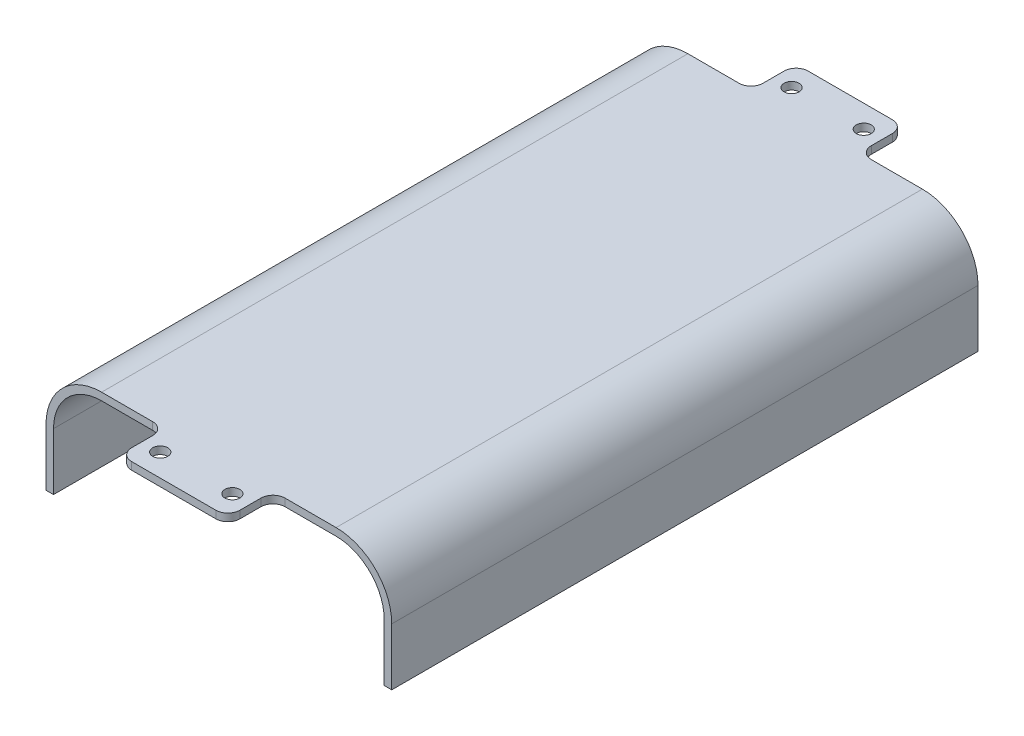
ISO-10303-21;
HEADER;
FILE_DESCRIPTION(('STEP AP214'),'2;1');
FILE_NAME('part.step','',(''),(''),'','','');
FILE_SCHEMA(('AUTOMOTIVE_DESIGN { 1 0 10303 214 1 1 1 1 }'));
ENDSEC;
DATA;
#1=APPLICATION_CONTEXT('core data for automotive mechanical design processes');
#2=APPLICATION_PROTOCOL_DEFINITION('international standard','automotive_design',2000,#1);
#3=PRODUCT_CONTEXT('',#1,'mechanical');
#4=PRODUCT('Part','Part','',(#3));
#5=PRODUCT_RELATED_PRODUCT_CATEGORY('part','',(#4));
#6=PRODUCT_DEFINITION_FORMATION('','',#4);
#7=PRODUCT_DEFINITION_CONTEXT('part definition',#1,'design');
#8=PRODUCT_DEFINITION('design','',#6,#7);
#9=PRODUCT_DEFINITION_SHAPE('','',#8);
#10=(LENGTH_UNIT() NAMED_UNIT(*) SI_UNIT(.MILLI.,.METRE.));
#11=(NAMED_UNIT(*) PLANE_ANGLE_UNIT() SI_UNIT($,.RADIAN.));
#12=(NAMED_UNIT(*) SI_UNIT($,.STERADIAN.) SOLID_ANGLE_UNIT());
#13=UNCERTAINTY_MEASURE_WITH_UNIT(LENGTH_MEASURE(1.E-05),#10,'distance_accuracy_value','');
#14=(GEOMETRIC_REPRESENTATION_CONTEXT(3) GLOBAL_UNCERTAINTY_ASSIGNED_CONTEXT((#13)) GLOBAL_UNIT_ASSIGNED_CONTEXT((#10,
#11,#12)) REPRESENTATION_CONTEXT('',''));
#15=CARTESIAN_POINT('',(0.,0.,0.));
#16=DIRECTION('',(0.,0.,1.));
#17=DIRECTION('',(1.,0.,0.));
#18=AXIS2_PLACEMENT_3D('',#15,#16,#17);
#19=CARTESIAN_POINT('',(-39.,1.50000000000002,225.));
#20=DIRECTION('',(0.,0.,1.));
#21=DIRECTION('',(1.,0.,0.));
#22=AXIS2_PLACEMENT_3D('',#19,#20,#21);
#23=PLANE('',#22);
#24=DIRECTION('',(0.,1.,0.));
#25=VECTOR('',#24,1.);
#26=CARTESIAN_POINT('',(14.,-17.5,225.));
#27=LINE('',#26,#25);
#28=CARTESIAN_POINT('',(14.,17.5,225.));
#29=VERTEX_POINT('',#28);
#30=CARTESIAN_POINT('',(14.,20.,225.));
#31=VERTEX_POINT('',#30);
#32=EDGE_CURVE('E495',#29,#31,#27,.T.);
#33=ORIENTED_EDGE('',*,*,#32,.T.);
#34=DIRECTION('',(-1.,0.,0.));
#35=VECTOR('',#34,1.);
#36=CARTESIAN_POINT('',(-39.,20.,225.));
#37=LINE('',#36,#35);
#38=CARTESIAN_POINT('',(-14.,20.,225.));
#39=VERTEX_POINT('',#38);
#40=EDGE_CURVE('E246',#31,#39,#37,.T.);
#41=ORIENTED_EDGE('',*,*,#40,.T.);
#42=DIRECTION('',(0.,1.,0.));
#43=VECTOR('',#42,1.);
#44=CARTESIAN_POINT('',(-14.,-17.5,225.));
#45=LINE('',#44,#43);
#46=CARTESIAN_POINT('',(-14.,17.5,225.));
#47=VERTEX_POINT('',#46);
#48=EDGE_CURVE('E434',#47,#39,#45,.T.);
#49=ORIENTED_EDGE('',*,*,#48,.F.);
#50=DIRECTION('',(-1.,0.,0.));
#51=VECTOR('',#50,1.);
#52=CARTESIAN_POINT('',(-39.,17.5,225.));
#53=LINE('',#52,#51);
#54=EDGE_CURVE('E354',#29,#47,#53,.T.);
#55=ORIENTED_EDGE('',*,*,#54,.F.);
#56=EDGE_LOOP('',(#33,#41,#49,#55));
#57=FACE_BOUND('',#56,.T.);
#58=ADVANCED_FACE('F34',(#57),#23,.T.);
#59=CARTESIAN_POINT('',(-39.,1.50000000000002,0.));
#60=DIRECTION('',(0.,0.,1.));
#61=DIRECTION('',(1.,0.,0.));
#62=AXIS2_PLACEMENT_3D('',#59,#60,#61);
#63=PLANE('',#62);
#64=DIRECTION('',(0.,1.,0.));
#65=VECTOR('',#64,1.);
#66=CARTESIAN_POINT('',(-14.,-17.5,0.));
#67=LINE('',#66,#65);
#68=CARTESIAN_POINT('',(-14.,17.5,0.));
#69=VERTEX_POINT('',#68);
#70=CARTESIAN_POINT('',(-14.,20.,0.));
#71=VERTEX_POINT('',#70);
#72=EDGE_CURVE('E403',#69,#71,#67,.T.);
#73=ORIENTED_EDGE('',*,*,#72,.T.);
#74=DIRECTION('',(-1.,0.,0.));
#75=VECTOR('',#74,1.);
#76=CARTESIAN_POINT('',(-39.,20.,0.));
#77=LINE('',#76,#75);
#78=CARTESIAN_POINT('',(14.,20.,0.));
#79=VERTEX_POINT('',#78);
#80=EDGE_CURVE('E252',#79,#71,#77,.T.);
#81=ORIENTED_EDGE('',*,*,#80,.F.);
#82=DIRECTION('',(0.,1.,0.));
#83=VECTOR('',#82,1.);
#84=CARTESIAN_POINT('',(14.,-17.5,0.));
#85=LINE('',#84,#83);
#86=CARTESIAN_POINT('',(14.,17.5,0.));
#87=VERTEX_POINT('',#86);
#88=EDGE_CURVE('E239',#87,#79,#85,.T.);
#89=ORIENTED_EDGE('',*,*,#88,.F.);
#90=DIRECTION('',(-1.,0.,0.));
#91=VECTOR('',#90,1.);
#92=CARTESIAN_POINT('',(-39.,17.5,0.));
#93=LINE('',#92,#91);
#94=EDGE_CURVE('E302',#87,#69,#93,.T.);
#95=ORIENTED_EDGE('',*,*,#94,.T.);
#96=EDGE_LOOP('',(#73,#81,#89,#95));
#97=FACE_BOUND('',#96,.T.);
#98=ADVANCED_FACE('F466',(#97),#63,.F.);
#99=CARTESIAN_POINT('',(-55.,-17.5,225.));
#100=DIRECTION('',(0.,1.,0.));
#101=DIRECTION('',(0.,0.,1.));
#102=AXIS2_PLACEMENT_3D('',#99,#100,#101);
#103=PLANE('',#102);
#104=DIRECTION('',(0.,0.,-1.));
#105=VECTOR('',#104,1.);
#106=CARTESIAN_POINT('',(-57.5,-17.5,225.));
#107=LINE('',#106,#105);
#108=CARTESIAN_POINT('',(-57.5,-17.5,210.));
#109=VERTEX_POINT('',#108);
#110=CARTESIAN_POINT('',(-57.5,-17.5,15.));
#111=VERTEX_POINT('',#110);
#112=EDGE_CURVE('E245',#109,#111,#107,.T.);
#113=ORIENTED_EDGE('',*,*,#112,.T.);
#114=DIRECTION('',(1.,0.,0.));
#115=VECTOR('',#114,1.);
#116=CARTESIAN_POINT('',(-22.,-17.5,15.));
#117=LINE('',#116,#115);
#118=CARTESIAN_POINT('',(-55.,-17.5,15.));
#119=VERTEX_POINT('',#118);
#120=EDGE_CURVE('E394',#111,#119,#117,.T.);
#121=ORIENTED_EDGE('',*,*,#120,.T.);
#122=DIRECTION('',(0.,0.,-1.));
#123=VECTOR('',#122,1.);
#124=CARTESIAN_POINT('',(-55.,-17.5,225.));
#125=LINE('',#124,#123);
#126=CARTESIAN_POINT('',(-55.,-17.5,210.));
#127=VERTEX_POINT('',#126);
#128=EDGE_CURVE('E360',#127,#119,#125,.T.);
#129=ORIENTED_EDGE('',*,*,#128,.F.);
#130=DIRECTION('',(-1.,0.,0.));
#131=VECTOR('',#130,1.);
#132=CARTESIAN_POINT('',(-22.,-17.5,210.));
#133=LINE('',#132,#131);
#134=EDGE_CURVE('E451',#127,#109,#133,.T.);
#135=ORIENTED_EDGE('',*,*,#134,.T.);
#136=EDGE_LOOP('',(#113,#121,#129,#135));
#137=FACE_BOUND('',#136,.T.);
#138=ADVANCED_FACE('F570',(#137),#103,.F.);
#139=CARTESIAN_POINT('',(57.5,1.50000000000002,225.));
#140=DIRECTION('',(-1.,0.,0.));
#141=DIRECTION('',(0.,0.,1.));
#142=AXIS2_PLACEMENT_3D('',#139,#140,#141);
#143=PLANE('',#142);
#144=DIRECTION('',(0.,0.,-1.));
#145=VECTOR('',#144,1.);
#146=CARTESIAN_POINT('',(57.5,-17.5,225.));
#147=LINE('',#146,#145);
#148=CARTESIAN_POINT('',(57.5,-17.5,210.));
#149=VERTEX_POINT('',#148);
#150=CARTESIAN_POINT('',(57.5,-17.5,15.));
#151=VERTEX_POINT('',#150);
#152=EDGE_CURVE('E236',#149,#151,#147,.T.);
#153=ORIENTED_EDGE('',*,*,#152,.T.);
#154=DIRECTION('',(0.,1.,0.));
#155=VECTOR('',#154,1.);
#156=CARTESIAN_POINT('',(57.5,-17.5,15.));
#157=LINE('',#156,#155);
#158=CARTESIAN_POINT('',(57.5,1.50000000000002,15.));
#159=VERTEX_POINT('',#158);
#160=EDGE_CURVE('E217',#151,#159,#157,.T.);
#161=ORIENTED_EDGE('',*,*,#160,.T.);
#162=DIRECTION('',(0.,0.,-1.));
#163=VECTOR('',#162,1.);
#164=CARTESIAN_POINT('',(57.5,1.50000000000002,225.));
#165=LINE('',#164,#163);
#166=CARTESIAN_POINT('',(57.5,1.50000000000002,210.));
#167=VERTEX_POINT('',#166);
#168=EDGE_CURVE('E263',#167,#159,#165,.T.);
#169=ORIENTED_EDGE('',*,*,#168,.F.);
#170=DIRECTION('',(0.,1.,0.));
#171=VECTOR('',#170,1.);
#172=CARTESIAN_POINT('',(57.5,-17.5,210.));
#173=LINE('',#172,#171);
#174=EDGE_CURVE('E244',#149,#167,#173,.T.);
#175=ORIENTED_EDGE('',*,*,#174,.F.);
#176=EDGE_LOOP('',(#153,#161,#169,#175));
#177=FACE_BOUND('',#176,.T.);
#178=ADVANCED_FACE('F243',(#177),#143,.F.);
#179=CARTESIAN_POINT('',(39.,1.50000000000002,225.));
#180=DIRECTION('',(0.,0.,-1.));
#181=DIRECTION('',(-1.,0.,0.));
#182=AXIS2_PLACEMENT_3D('',#179,#180,#181);
#183=CYLINDRICAL_SURFACE('',#182,18.5);
#184=ORIENTED_EDGE('',*,*,#168,.T.);
#185=CARTESIAN_POINT('',(39.,1.50000000000002,15.));
#186=DIRECTION('',(0.,0.,1.));
#187=DIRECTION('',(1.,0.,0.));
#188=AXIS2_PLACEMENT_3D('',#185,#186,#187);
#189=CIRCLE('',#188,18.5);
#190=CARTESIAN_POINT('',(39.,20.,15.));
#191=VERTEX_POINT('',#190);
#192=EDGE_CURVE('E223',#159,#191,#189,.T.);
#193=ORIENTED_EDGE('',*,*,#192,.T.);
#194=DIRECTION('',(0.,0.,-1.));
#195=VECTOR('',#194,1.);
#196=CARTESIAN_POINT('',(39.,20.,225.));
#197=LINE('',#196,#195);
#198=CARTESIAN_POINT('',(39.,20.,210.));
#199=VERTEX_POINT('',#198);
#200=EDGE_CURVE('E373',#199,#191,#197,.T.);
#201=ORIENTED_EDGE('',*,*,#200,.F.);
#202=CARTESIAN_POINT('',(39.,1.50000000000002,210.));
#203=DIRECTION('',(0.,0.,-1.));
#204=DIRECTION('',(-1.,0.,0.));
#205=AXIS2_PLACEMENT_3D('',#202,#203,#204);
#206=CIRCLE('',#205,18.5);
#207=EDGE_CURVE('E346',#199,#167,#206,.T.);
#208=ORIENTED_EDGE('',*,*,#207,.T.);
#209=EDGE_LOOP('',(#184,#193,#201,#208));
#210=FACE_BOUND('',#209,.T.);
#211=ADVANCED_FACE('F538',(#210),#183,.T.);
#212=CARTESIAN_POINT('',(-39.,20.,225.));
#213=DIRECTION('',(0.,-1.,0.));
#214=DIRECTION('',(0.,0.,-1.));
#215=AXIS2_PLACEMENT_3D('',#212,#213,#214);
#216=PLANE('',#215);
#217=CARTESIAN_POINT('',(12.,20.,7.5));
#218=DIRECTION('',(0.,1.,0.));
#219=DIRECTION('',(0.,0.,1.));
#220=AXIS2_PLACEMENT_3D('',#217,#218,#219);
#221=CIRCLE('',#220,2.5);
#222=CARTESIAN_POINT('',(12.,20.,10.));
#223=VERTEX_POINT('',#222);
#224=EDGE_CURVE('E406',#223,#223,#221,.T.);
#225=ORIENTED_EDGE('',*,*,#224,.F.);
#226=EDGE_LOOP('',(#225));
#227=FACE_BOUND('',#226,.T.);
#228=CARTESIAN_POINT('',(-12.,20.,7.5));
#229=DIRECTION('',(0.,1.,0.));
#230=DIRECTION('',(0.,0.,1.));
#231=AXIS2_PLACEMENT_3D('',#228,#229,#230);
#232=CIRCLE('',#231,2.5);
#233=CARTESIAN_POINT('',(-12.,20.,10.));
#234=VERTEX_POINT('',#233);
#235=EDGE_CURVE('E413',#234,#234,#232,.T.);
#236=ORIENTED_EDGE('',*,*,#235,.F.);
#237=EDGE_LOOP('',(#236));
#238=FACE_BOUND('',#237,.T.);
#239=CARTESIAN_POINT('',(12.,20.,217.5));
#240=DIRECTION('',(0.,1.,0.));
#241=DIRECTION('',(0.,0.,-1.));
#242=AXIS2_PLACEMENT_3D('',#239,#240,#241);
#243=CIRCLE('',#242,2.49999999999999);
#244=CARTESIAN_POINT('',(12.,20.,215.));
#245=VERTEX_POINT('',#244);
#246=EDGE_CURVE('E409',#245,#245,#243,.T.);
#247=ORIENTED_EDGE('',*,*,#246,.F.);
#248=EDGE_LOOP('',(#247));
#249=FACE_BOUND('',#248,.T.);
#250=CARTESIAN_POINT('',(-12.,20.,217.5));
#251=DIRECTION('',(0.,1.,0.));
#252=DIRECTION('',(0.,0.,-1.));
#253=AXIS2_PLACEMENT_3D('',#250,#251,#252);
#254=CIRCLE('',#253,2.5);
#255=CARTESIAN_POINT('',(-12.,20.,215.));
#256=VERTEX_POINT('',#255);
#257=EDGE_CURVE('E412',#256,#256,#254,.T.);
#258=ORIENTED_EDGE('',*,*,#257,.F.);
#259=EDGE_LOOP('',(#258));
#260=FACE_BOUND('',#259,.T.);
#261=CARTESIAN_POINT('',(-22.,20.,11.));
#262=DIRECTION('',(0.,1.,0.));
#263=DIRECTION('',(0.,0.,-1.));
#264=AXIS2_PLACEMENT_3D('',#261,#262,#263);
#265=CIRCLE('',#264,4.);
#266=CARTESIAN_POINT('',(-22.,20.,15.));
#267=VERTEX_POINT('',#266);
#268=CARTESIAN_POINT('',(-18.,20.,11.));
#269=VERTEX_POINT('',#268);
#270=EDGE_CURVE('E228',#267,#269,#265,.T.);
#271=ORIENTED_EDGE('',*,*,#270,.F.);
#272=DIRECTION('',(1.,0.,0.));
#273=VECTOR('',#272,1.);
#274=CARTESIAN_POINT('',(-74.033168474898,20.,15.));
#275=LINE('',#274,#273);
#276=CARTESIAN_POINT('',(-39.,20.,15.));
#277=VERTEX_POINT('',#276);
#278=EDGE_CURVE('E390',#277,#267,#275,.T.);
#279=ORIENTED_EDGE('',*,*,#278,.F.);
#280=DIRECTION('',(0.,0.,-1.));
#281=VECTOR('',#280,1.);
#282=CARTESIAN_POINT('',(-39.,20.,225.));
#283=LINE('',#282,#281);
#284=CARTESIAN_POINT('',(-39.,20.,210.));
#285=VERTEX_POINT('',#284);
#286=EDGE_CURVE('E375',#285,#277,#283,.T.);
#287=ORIENTED_EDGE('',*,*,#286,.F.);
#288=DIRECTION('',(-1.,0.,0.));
#289=VECTOR('',#288,1.);
#290=CARTESIAN_POINT('',(-74.033168474898,20.,210.));
#291=LINE('',#290,#289);
#292=CARTESIAN_POINT('',(-22.,20.,210.));
#293=VERTEX_POINT('',#292);
#294=EDGE_CURVE('E455',#293,#285,#291,.T.);
#295=ORIENTED_EDGE('',*,*,#294,.F.);
#296=CARTESIAN_POINT('',(-22.,20.,214.));
#297=DIRECTION('',(0.,1.,0.));
#298=DIRECTION('',(0.,0.,1.));
#299=AXIS2_PLACEMENT_3D('',#296,#297,#298);
#300=CIRCLE('',#299,4.);
#301=CARTESIAN_POINT('',(-18.,20.,214.));
#302=VERTEX_POINT('',#301);
#303=EDGE_CURVE('E433',#302,#293,#300,.T.);
#304=ORIENTED_EDGE('',*,*,#303,.F.);
#305=DIRECTION('',(0.,0.,-1.));
#306=VECTOR('',#305,1.);
#307=CARTESIAN_POINT('',(-18.,20.,221.));
#308=LINE('',#307,#306);
#309=CARTESIAN_POINT('',(-18.,20.,221.));
#310=VERTEX_POINT('',#309);
#311=EDGE_CURVE('E512',#310,#302,#308,.T.);
#312=ORIENTED_EDGE('',*,*,#311,.F.);
#313=CARTESIAN_POINT('',(-14.,20.,221.));
#314=DIRECTION('',(0.,-1.,0.));
#315=DIRECTION('',(0.,0.,1.));
#316=AXIS2_PLACEMENT_3D('',#313,#314,#315);
#317=CIRCLE('',#316,4.);
#318=EDGE_CURVE('E449',#39,#310,#317,.T.);
#319=ORIENTED_EDGE('',*,*,#318,.F.);
#320=ORIENTED_EDGE('',*,*,#40,.F.);
#321=CARTESIAN_POINT('',(14.,20.,221.));
#322=DIRECTION('',(0.,-1.,0.));
#323=DIRECTION('',(0.,0.,-1.));
#324=AXIS2_PLACEMENT_3D('',#321,#322,#323);
#325=CIRCLE('',#324,4.);
#326=CARTESIAN_POINT('',(18.,20.,221.));
#327=VERTEX_POINT('',#326);
#328=EDGE_CURVE('E497',#327,#31,#325,.T.);
#329=ORIENTED_EDGE('',*,*,#328,.F.);
#330=DIRECTION('',(0.,0.,1.));
#331=VECTOR('',#330,1.);
#332=CARTESIAN_POINT('',(18.,20.,221.));
#333=LINE('',#332,#331);
#334=CARTESIAN_POINT('',(18.,20.,214.));
#335=VERTEX_POINT('',#334);
#336=EDGE_CURVE('E496',#335,#327,#333,.T.);
#337=ORIENTED_EDGE('',*,*,#336,.F.);
#338=CARTESIAN_POINT('',(22.,20.,214.));
#339=DIRECTION('',(0.,1.,0.));
#340=DIRECTION('',(0.,0.,1.));
#341=AXIS2_PLACEMENT_3D('',#338,#339,#340);
#342=CIRCLE('',#341,4.00000000000002);
#343=CARTESIAN_POINT('',(22.,20.,210.));
#344=VERTEX_POINT('',#343);
#345=EDGE_CURVE('E501',#344,#335,#342,.T.);
#346=ORIENTED_EDGE('',*,*,#345,.F.);
#347=DIRECTION('',(-1.,0.,0.));
#348=VECTOR('',#347,1.);
#349=CARTESIAN_POINT('',(22.,20.,210.));
#350=LINE('',#349,#348);
#351=EDGE_CURVE('E499',#199,#344,#350,.T.);
#352=ORIENTED_EDGE('',*,*,#351,.F.);
#353=ORIENTED_EDGE('',*,*,#200,.T.);
#354=DIRECTION('',(1.,0.,0.));
#355=VECTOR('',#354,1.);
#356=CARTESIAN_POINT('',(22.,20.,15.));
#357=LINE('',#356,#355);
#358=CARTESIAN_POINT('',(22.,20.,15.));
#359=VERTEX_POINT('',#358);
#360=EDGE_CURVE('E240',#359,#191,#357,.T.);
#361=ORIENTED_EDGE('',*,*,#360,.F.);
#362=CARTESIAN_POINT('',(22.,20.,11.));
#363=DIRECTION('',(0.,1.,0.));
#364=DIRECTION('',(0.,0.,-1.));
#365=AXIS2_PLACEMENT_3D('',#362,#363,#364);
#366=CIRCLE('',#365,4.);
#367=CARTESIAN_POINT('',(18.,20.,11.));
#368=VERTEX_POINT('',#367);
#369=EDGE_CURVE('E481',#368,#359,#366,.T.);
#370=ORIENTED_EDGE('',*,*,#369,.F.);
#371=DIRECTION('',(0.,0.,1.));
#372=VECTOR('',#371,1.);
#373=CARTESIAN_POINT('',(18.,20.,4.00000000000003));
#374=LINE('',#373,#372);
#375=CARTESIAN_POINT('',(18.,20.,4.00000000000003));
#376=VERTEX_POINT('',#375);
#377=EDGE_CURVE('E478',#376,#368,#374,.T.);
#378=ORIENTED_EDGE('',*,*,#377,.F.);
#379=CARTESIAN_POINT('',(14.,20.,4.));
#380=DIRECTION('',(0.,-1.,0.));
#381=DIRECTION('',(0.,0.,1.));
#382=AXIS2_PLACEMENT_3D('',#379,#380,#381);
#383=CIRCLE('',#382,4.);
#384=EDGE_CURVE('E473',#79,#376,#383,.T.);
#385=ORIENTED_EDGE('',*,*,#384,.F.);
#386=ORIENTED_EDGE('',*,*,#80,.T.);
#387=CARTESIAN_POINT('',(-14.,20.,4.));
#388=DIRECTION('',(0.,-1.,0.));
#389=DIRECTION('',(0.,0.,-1.));
#390=AXIS2_PLACEMENT_3D('',#387,#388,#389);
#391=CIRCLE('',#390,4.);
#392=CARTESIAN_POINT('',(-18.,20.,4.00000000000003));
#393=VERTEX_POINT('',#392);
#394=EDGE_CURVE('E395',#393,#71,#391,.T.);
#395=ORIENTED_EDGE('',*,*,#394,.F.);
#396=DIRECTION('',(0.,0.,-1.));
#397=VECTOR('',#396,1.);
#398=CARTESIAN_POINT('',(-18.,20.,4.00000000000003));
#399=LINE('',#398,#397);
#400=EDGE_CURVE('E399',#269,#393,#399,.T.);
#401=ORIENTED_EDGE('',*,*,#400,.F.);
#402=EDGE_LOOP('',(#271,#279,#287,#295,#304,#312,#319,#320,#329,#337,#346,#352,#353,#361,#370,
#378,#385,#386,#395,#401));
#403=FACE_BOUND('',#402,.T.);
#404=ADVANCED_FACE('F392',(#227,#238,#249,#260,#403),#216,.F.);
#405=CARTESIAN_POINT('',(-39.,1.50000000000002,225.));
#406=DIRECTION('',(0.,0.,-1.));
#407=DIRECTION('',(-1.,0.,0.));
#408=AXIS2_PLACEMENT_3D('',#405,#406,#407);
#409=CYLINDRICAL_SURFACE('',#408,18.5);
#410=ORIENTED_EDGE('',*,*,#286,.T.);
#411=CARTESIAN_POINT('',(-39.,1.50000000000002,15.));
#412=DIRECTION('',(0.,0.,1.));
#413=DIRECTION('',(1.,0.,0.));
#414=AXIS2_PLACEMENT_3D('',#411,#412,#413);
#415=CIRCLE('',#414,18.5);
#416=CARTESIAN_POINT('',(-57.5,1.50000000000002,15.));
#417=VERTEX_POINT('',#416);
#418=EDGE_CURVE('E270',#277,#417,#415,.T.);
#419=ORIENTED_EDGE('',*,*,#418,.T.);
#420=DIRECTION('',(0.,0.,-1.));
#421=VECTOR('',#420,1.);
#422=CARTESIAN_POINT('',(-57.5,1.50000000000002,225.));
#423=LINE('',#422,#421);
#424=CARTESIAN_POINT('',(-57.5,1.50000000000002,210.));
#425=VERTEX_POINT('',#424);
#426=EDGE_CURVE('E249',#425,#417,#423,.T.);
#427=ORIENTED_EDGE('',*,*,#426,.F.);
#428=CARTESIAN_POINT('',(-39.,1.50000000000002,210.));
#429=DIRECTION('',(0.,0.,-1.));
#430=DIRECTION('',(-1.,0.,0.));
#431=AXIS2_PLACEMENT_3D('',#428,#429,#430);
#432=CIRCLE('',#431,18.5);
#433=EDGE_CURVE('E337',#425,#285,#432,.T.);
#434=ORIENTED_EDGE('',*,*,#433,.T.);
#435=EDGE_LOOP('',(#410,#419,#427,#434));
#436=FACE_BOUND('',#435,.T.);
#437=ADVANCED_FACE('F386',(#436),#409,.T.);
#438=CARTESIAN_POINT('',(-57.5,1.50000000000002,225.));
#439=DIRECTION('',(1.,0.,0.));
#440=DIRECTION('',(0.,0.,-1.));
#441=AXIS2_PLACEMENT_3D('',#438,#439,#440);
#442=PLANE('',#441);
#443=ORIENTED_EDGE('',*,*,#426,.T.);
#444=DIRECTION('',(0.,-1.,0.));
#445=VECTOR('',#444,1.);
#446=CARTESIAN_POINT('',(-57.5,1.50000000000002,15.));
#447=LINE('',#446,#445);
#448=EDGE_CURVE('E332',#417,#111,#447,.T.);
#449=ORIENTED_EDGE('',*,*,#448,.T.);
#450=ORIENTED_EDGE('',*,*,#112,.F.);
#451=DIRECTION('',(0.,1.,0.));
#452=VECTOR('',#451,1.);
#453=CARTESIAN_POINT('',(-57.5,1.50000000000002,210.));
#454=LINE('',#453,#452);
#455=EDGE_CURVE('E385',#109,#425,#454,.T.);
#456=ORIENTED_EDGE('',*,*,#455,.T.);
#457=EDGE_LOOP('',(#443,#449,#450,#456));
#458=FACE_BOUND('',#457,.T.);
#459=ADVANCED_FACE('F36',(#458),#442,.F.);
#460=DIRECTION('',(0.,0.,-1.));
#461=VECTOR('',#460,1.);
#462=CARTESIAN_POINT('',(55.,-17.5,225.));
#463=LINE('',#462,#461);
#464=CARTESIAN_POINT('',(55.,-17.5,210.));
#465=VERTEX_POINT('',#464);
#466=CARTESIAN_POINT('',(55.,-17.5,15.));
#467=VERTEX_POINT('',#466);
#468=EDGE_CURVE('E238',#465,#467,#463,.T.);
#469=ORIENTED_EDGE('',*,*,#468,.T.);
#470=DIRECTION('',(1.,0.,0.));
#471=VECTOR('',#470,1.);
#472=CARTESIAN_POINT('',(22.,-17.5,15.));
#473=LINE('',#472,#471);
#474=EDGE_CURVE('E220',#467,#151,#473,.T.);
#475=ORIENTED_EDGE('',*,*,#474,.T.);
#476=ORIENTED_EDGE('',*,*,#152,.F.);
#477=DIRECTION('',(-1.,0.,0.));
#478=VECTOR('',#477,1.);
#479=CARTESIAN_POINT('',(22.,-17.5,210.));
#480=LINE('',#479,#478);
#481=EDGE_CURVE('E493',#149,#465,#480,.T.);
#482=ORIENTED_EDGE('',*,*,#481,.T.);
#483=EDGE_LOOP('',(#469,#475,#476,#482));
#484=FACE_BOUND('',#483,.T.);
#485=ADVANCED_FACE('F234',(#484),#103,.F.);
#486=CARTESIAN_POINT('',(55.,1.50000000000002,225.));
#487=DIRECTION('',(-1.,0.,0.));
#488=DIRECTION('',(0.,0.,1.));
#489=AXIS2_PLACEMENT_3D('',#486,#487,#488);
#490=PLANE('',#489);
#491=DIRECTION('',(0.,1.,0.));
#492=VECTOR('',#491,1.);
#493=CARTESIAN_POINT('',(55.,1.50000000000002,15.));
#494=LINE('',#493,#492);
#495=CARTESIAN_POINT('',(55.,1.50000000000002,15.));
#496=VERTEX_POINT('',#495);
#497=EDGE_CURVE('E351',#467,#496,#494,.T.);
#498=ORIENTED_EDGE('',*,*,#497,.F.);
#499=ORIENTED_EDGE('',*,*,#468,.F.);
#500=DIRECTION('',(0.,-1.,0.));
#501=VECTOR('',#500,1.);
#502=CARTESIAN_POINT('',(55.,1.50000000000002,210.));
#503=LINE('',#502,#501);
#504=CARTESIAN_POINT('',(55.,1.50000000000002,210.));
#505=VERTEX_POINT('',#504);
#506=EDGE_CURVE('E344',#505,#465,#503,.T.);
#507=ORIENTED_EDGE('',*,*,#506,.F.);
#508=DIRECTION('',(0.,0.,-1.));
#509=VECTOR('',#508,1.);
#510=CARTESIAN_POINT('',(55.,1.50000000000002,225.));
#511=LINE('',#510,#509);
#512=EDGE_CURVE('E259',#505,#496,#511,.T.);
#513=ORIENTED_EDGE('',*,*,#512,.T.);
#514=EDGE_LOOP('',(#498,#499,#507,#513));
#515=FACE_BOUND('',#514,.T.);
#516=ADVANCED_FACE('F542',(#515),#490,.T.);
#517=CARTESIAN_POINT('',(39.,1.50000000000002,225.));
#518=DIRECTION('',(0.,0.,-1.));
#519=DIRECTION('',(-1.,0.,0.));
#520=AXIS2_PLACEMENT_3D('',#517,#518,#519);
#521=CYLINDRICAL_SURFACE('',#520,16.);
#522=CARTESIAN_POINT('',(39.,1.50000000000002,15.));
#523=DIRECTION('',(0.,0.,1.));
#524=DIRECTION('',(1.,0.,0.));
#525=AXIS2_PLACEMENT_3D('',#522,#523,#524);
#526=CIRCLE('',#525,16.);
#527=CARTESIAN_POINT('',(39.,17.5,15.));
#528=VERTEX_POINT('',#527);
#529=EDGE_CURVE('E349',#496,#528,#526,.T.);
#530=ORIENTED_EDGE('',*,*,#529,.F.);
#531=ORIENTED_EDGE('',*,*,#512,.F.);
#532=CARTESIAN_POINT('',(39.,1.50000000000002,210.));
#533=DIRECTION('',(0.,0.,-1.));
#534=DIRECTION('',(-1.,0.,0.));
#535=AXIS2_PLACEMENT_3D('',#532,#533,#534);
#536=CIRCLE('',#535,16.);
#537=CARTESIAN_POINT('',(39.,17.5,210.));
#538=VERTEX_POINT('',#537);
#539=EDGE_CURVE('E269',#538,#505,#536,.T.);
#540=ORIENTED_EDGE('',*,*,#539,.F.);
#541=DIRECTION('',(0.,0.,-1.));
#542=VECTOR('',#541,1.);
#543=CARTESIAN_POINT('',(39.,17.5,225.));
#544=LINE('',#543,#542);
#545=EDGE_CURVE('E367',#538,#528,#544,.T.);
#546=ORIENTED_EDGE('',*,*,#545,.T.);
#547=EDGE_LOOP('',(#530,#531,#540,#546));
#548=FACE_BOUND('',#547,.T.);
#549=ADVANCED_FACE('F547',(#548),#521,.F.);
#550=CARTESIAN_POINT('',(-39.,17.5,225.));
#551=DIRECTION('',(0.,-1.,0.));
#552=DIRECTION('',(0.,0.,-1.));
#553=AXIS2_PLACEMENT_3D('',#550,#551,#552);
#554=PLANE('',#553);
#555=DIRECTION('',(-1.,0.,0.));
#556=VECTOR('',#555,1.);
#557=CARTESIAN_POINT('',(-39.,17.5,15.));
#558=LINE('',#557,#556);
#559=CARTESIAN_POINT('',(-22.,17.5,15.));
#560=VERTEX_POINT('',#559);
#561=CARTESIAN_POINT('',(-39.,17.5,15.));
#562=VERTEX_POINT('',#561);
#563=EDGE_CURVE('E326',#560,#562,#558,.T.);
#564=ORIENTED_EDGE('',*,*,#563,.F.);
#565=CARTESIAN_POINT('',(-22.,17.5,11.));
#566=DIRECTION('',(0.,-1.,0.));
#567=DIRECTION('',(0.,0.,-1.));
#568=AXIS2_PLACEMENT_3D('',#565,#566,#567);
#569=CIRCLE('',#568,4.);
#570=CARTESIAN_POINT('',(-18.,17.5,11.));
#571=VERTEX_POINT('',#570);
#572=EDGE_CURVE('E292',#571,#560,#569,.T.);
#573=ORIENTED_EDGE('',*,*,#572,.F.);
#574=DIRECTION('',(0.,0.,1.));
#575=VECTOR('',#574,1.);
#576=CARTESIAN_POINT('',(-17.9999999999999,17.5,225.));
#577=LINE('',#576,#575);
#578=CARTESIAN_POINT('',(-18.,17.5,4.00000000000003));
#579=VERTEX_POINT('',#578);
#580=EDGE_CURVE('E42',#579,#571,#577,.T.);
#581=ORIENTED_EDGE('',*,*,#580,.F.);
#582=CARTESIAN_POINT('',(-14.,17.5,4.));
#583=DIRECTION('',(0.,-1.,0.));
#584=DIRECTION('',(0.,0.,-1.));
#585=AXIS2_PLACEMENT_3D('',#582,#583,#584);
#586=CIRCLE('',#585,4.);
#587=EDGE_CURVE('E11',#69,#579,#586,.F.);
#588=ORIENTED_EDGE('',*,*,#587,.F.);
#589=ORIENTED_EDGE('',*,*,#94,.F.);
#590=CARTESIAN_POINT('',(14.,17.5,4.));
#591=DIRECTION('',(0.,-1.,0.));
#592=DIRECTION('',(0.,0.,-1.));
#593=AXIS2_PLACEMENT_3D('',#590,#591,#592);
#594=CIRCLE('',#593,4.);
#595=CARTESIAN_POINT('',(18.,17.5,4.00000000000003));
#596=VERTEX_POINT('',#595);
#597=EDGE_CURVE('E284',#596,#87,#594,.F.);
#598=ORIENTED_EDGE('',*,*,#597,.F.);
#599=DIRECTION('',(0.,0.,-1.));
#600=VECTOR('',#599,1.);
#601=CARTESIAN_POINT('',(18.0000000000001,17.5,225.));
#602=LINE('',#601,#600);
#603=CARTESIAN_POINT('',(18.,17.5,11.));
#604=VERTEX_POINT('',#603);
#605=EDGE_CURVE('E286',#604,#596,#602,.T.);
#606=ORIENTED_EDGE('',*,*,#605,.F.);
#607=CARTESIAN_POINT('',(22.,17.5,11.));
#608=DIRECTION('',(0.,-1.,0.));
#609=DIRECTION('',(0.,0.,-1.));
#610=AXIS2_PLACEMENT_3D('',#607,#608,#609);
#611=CIRCLE('',#610,4.);
#612=CARTESIAN_POINT('',(22.,17.5,15.));
#613=VERTEX_POINT('',#612);
#614=EDGE_CURVE('E288',#613,#604,#611,.T.);
#615=ORIENTED_EDGE('',*,*,#614,.F.);
#616=DIRECTION('',(-1.,0.,0.));
#617=VECTOR('',#616,1.);
#618=CARTESIAN_POINT('',(-39.,17.5,15.));
#619=LINE('',#618,#617);
#620=EDGE_CURVE('E290',#528,#613,#619,.T.);
#621=ORIENTED_EDGE('',*,*,#620,.F.);
#622=ORIENTED_EDGE('',*,*,#545,.F.);
#623=DIRECTION('',(1.,0.,0.));
#624=VECTOR('',#623,1.);
#625=CARTESIAN_POINT('',(-39.,17.5,210.));
#626=LINE('',#625,#624);
#627=CARTESIAN_POINT('',(22.,17.5,210.));
#628=VERTEX_POINT('',#627);
#629=EDGE_CURVE('E276',#628,#538,#626,.T.);
#630=ORIENTED_EDGE('',*,*,#629,.F.);
#631=CARTESIAN_POINT('',(22.,17.5,214.));
#632=DIRECTION('',(0.,-1.,0.));
#633=DIRECTION('',(0.,0.,-1.));
#634=AXIS2_PLACEMENT_3D('',#631,#632,#633);
#635=CIRCLE('',#634,4.00000000000002);
#636=CARTESIAN_POINT('',(18.,17.5,214.));
#637=VERTEX_POINT('',#636);
#638=EDGE_CURVE('E278',#637,#628,#635,.T.);
#639=ORIENTED_EDGE('',*,*,#638,.F.);
#640=DIRECTION('',(0.,0.,-1.));
#641=VECTOR('',#640,1.);
#642=CARTESIAN_POINT('',(18.,17.5,225.));
#643=LINE('',#642,#641);
#644=CARTESIAN_POINT('',(18.,17.5,221.));
#645=VERTEX_POINT('',#644);
#646=EDGE_CURVE('E280',#645,#637,#643,.T.);
#647=ORIENTED_EDGE('',*,*,#646,.F.);
#648=CARTESIAN_POINT('',(14.,17.5,221.));
#649=DIRECTION('',(0.,-1.,0.));
#650=DIRECTION('',(0.,0.,-1.));
#651=AXIS2_PLACEMENT_3D('',#648,#649,#650);
#652=CIRCLE('',#651,4.);
#653=EDGE_CURVE('E282',#29,#645,#652,.F.);
#654=ORIENTED_EDGE('',*,*,#653,.F.);
#655=ORIENTED_EDGE('',*,*,#54,.T.);
#656=CARTESIAN_POINT('',(-14.,17.5,221.));
#657=DIRECTION('',(0.,-1.,0.));
#658=DIRECTION('',(0.,0.,-1.));
#659=AXIS2_PLACEMENT_3D('',#656,#657,#658);
#660=CIRCLE('',#659,4.);
#661=CARTESIAN_POINT('',(-18.,17.5,221.));
#662=VERTEX_POINT('',#661);
#663=EDGE_CURVE('E274',#662,#47,#660,.F.);
#664=ORIENTED_EDGE('',*,*,#663,.F.);
#665=DIRECTION('',(0.,0.,1.));
#666=VECTOR('',#665,1.);
#667=CARTESIAN_POINT('',(-18.,17.5,225.));
#668=LINE('',#667,#666);
#669=CARTESIAN_POINT('',(-18.,17.5,214.));
#670=VERTEX_POINT('',#669);
#671=EDGE_CURVE('E265',#670,#662,#668,.T.);
#672=ORIENTED_EDGE('',*,*,#671,.F.);
#673=CARTESIAN_POINT('',(-22.,17.5,214.));
#674=DIRECTION('',(0.,-1.,0.));
#675=DIRECTION('',(0.,0.,-1.));
#676=AXIS2_PLACEMENT_3D('',#673,#674,#675);
#677=CIRCLE('',#676,4.);
#678=CARTESIAN_POINT('',(-22.,17.5,210.));
#679=VERTEX_POINT('',#678);
#680=EDGE_CURVE('E272',#679,#670,#677,.T.);
#681=ORIENTED_EDGE('',*,*,#680,.F.);
#682=DIRECTION('',(1.,0.,0.));
#683=VECTOR('',#682,1.);
#684=CARTESIAN_POINT('',(-39.,17.5,210.));
#685=LINE('',#684,#683);
#686=CARTESIAN_POINT('',(-39.,17.5,210.));
#687=VERTEX_POINT('',#686);
#688=EDGE_CURVE('E420',#687,#679,#685,.T.);
#689=ORIENTED_EDGE('',*,*,#688,.F.);
#690=DIRECTION('',(0.,0.,-1.));
#691=VECTOR('',#690,1.);
#692=CARTESIAN_POINT('',(-39.,17.5,225.));
#693=LINE('',#692,#691);
#694=EDGE_CURVE('E329',#687,#562,#693,.T.);
#695=ORIENTED_EDGE('',*,*,#694,.T.);
#696=EDGE_LOOP('',(#564,#573,#581,#588,#589,#598,#606,#615,#621,#622,#630,#639,#647,#654,#655,
#664,#672,#681,#689,#695));
#697=FACE_BOUND('',#696,.T.);
#698=CARTESIAN_POINT('',(12.,17.5,7.5));
#699=DIRECTION('',(0.,-1.,0.));
#700=DIRECTION('',(0.,0.,-1.));
#701=AXIS2_PLACEMENT_3D('',#698,#699,#700);
#702=CIRCLE('',#701,2.5);
#703=CARTESIAN_POINT('',(12.,17.5,5.));
#704=VERTEX_POINT('',#703);
#705=EDGE_CURVE('E299',#704,#704,#702,.T.);
#706=ORIENTED_EDGE('',*,*,#705,.F.);
#707=EDGE_LOOP('',(#706));
#708=FACE_BOUND('',#707,.T.);
#709=CARTESIAN_POINT('',(-12.,17.5,7.5));
#710=DIRECTION('',(0.,-1.,0.));
#711=DIRECTION('',(0.,0.,-1.));
#712=AXIS2_PLACEMENT_3D('',#709,#710,#711);
#713=CIRCLE('',#712,2.5);
#714=CARTESIAN_POINT('',(-12.,17.5,5.));
#715=VERTEX_POINT('',#714);
#716=EDGE_CURVE('E296',#715,#715,#713,.T.);
#717=ORIENTED_EDGE('',*,*,#716,.F.);
#718=EDGE_LOOP('',(#717));
#719=FACE_BOUND('',#718,.T.);
#720=CARTESIAN_POINT('',(12.,17.5,217.5));
#721=DIRECTION('',(0.,-1.,0.));
#722=DIRECTION('',(0.,0.,-1.));
#723=AXIS2_PLACEMENT_3D('',#720,#721,#722);
#724=CIRCLE('',#723,2.49999999999999);
#725=CARTESIAN_POINT('',(12.,17.5,215.));
#726=VERTEX_POINT('',#725);
#727=EDGE_CURVE('E293',#726,#726,#724,.T.);
#728=ORIENTED_EDGE('',*,*,#727,.F.);
#729=EDGE_LOOP('',(#728));
#730=FACE_BOUND('',#729,.T.);
#731=CARTESIAN_POINT('',(-12.,17.5,217.5));
#732=DIRECTION('',(0.,-1.,0.));
#733=DIRECTION('',(0.,0.,-1.));
#734=AXIS2_PLACEMENT_3D('',#731,#732,#733);
#735=CIRCLE('',#734,2.5);
#736=CARTESIAN_POINT('',(-12.,17.5,215.));
#737=VERTEX_POINT('',#736);
#738=EDGE_CURVE('E266',#737,#737,#735,.T.);
#739=ORIENTED_EDGE('',*,*,#738,.F.);
#740=EDGE_LOOP('',(#739));
#741=FACE_BOUND('',#740,.T.);
#742=ADVANCED_FACE('F323',(#697,#708,#719,#730,#741),#554,.T.);
#743=CARTESIAN_POINT('',(-39.,1.50000000000002,225.));
#744=DIRECTION('',(0.,0.,-1.));
#745=DIRECTION('',(-1.,0.,0.));
#746=AXIS2_PLACEMENT_3D('',#743,#744,#745);
#747=CYLINDRICAL_SURFACE('',#746,16.);
#748=CARTESIAN_POINT('',(-39.,1.50000000000002,15.));
#749=DIRECTION('',(0.,0.,1.));
#750=DIRECTION('',(1.,0.,0.));
#751=AXIS2_PLACEMENT_3D('',#748,#749,#750);
#752=CIRCLE('',#751,16.);
#753=CARTESIAN_POINT('',(-55.,1.50000000000002,15.));
#754=VERTEX_POINT('',#753);
#755=EDGE_CURVE('E333',#562,#754,#752,.T.);
#756=ORIENTED_EDGE('',*,*,#755,.F.);
#757=ORIENTED_EDGE('',*,*,#694,.F.);
#758=CARTESIAN_POINT('',(-39.,1.50000000000002,210.));
#759=DIRECTION('',(0.,0.,-1.));
#760=DIRECTION('',(-1.,0.,0.));
#761=AXIS2_PLACEMENT_3D('',#758,#759,#760);
#762=CIRCLE('',#761,16.);
#763=CARTESIAN_POINT('',(-55.,1.50000000000002,210.));
#764=VERTEX_POINT('',#763);
#765=EDGE_CURVE('E418',#764,#687,#762,.T.);
#766=ORIENTED_EDGE('',*,*,#765,.F.);
#767=DIRECTION('',(0.,0.,-1.));
#768=VECTOR('',#767,1.);
#769=CARTESIAN_POINT('',(-55.,1.50000000000002,225.));
#770=LINE('',#769,#768);
#771=EDGE_CURVE('E363',#764,#754,#770,.T.);
#772=ORIENTED_EDGE('',*,*,#771,.T.);
#773=EDGE_LOOP('',(#756,#757,#766,#772));
#774=FACE_BOUND('',#773,.T.);
#775=ADVANCED_FACE('F609',(#774),#747,.F.);
#776=CARTESIAN_POINT('',(-55.,1.50000000000002,225.));
#777=DIRECTION('',(1.,0.,0.));
#778=DIRECTION('',(0.,0.,-1.));
#779=AXIS2_PLACEMENT_3D('',#776,#777,#778);
#780=PLANE('',#779);
#781=DIRECTION('',(0.,-1.,0.));
#782=VECTOR('',#781,1.);
#783=CARTESIAN_POINT('',(-55.,1.50000000000002,15.));
#784=LINE('',#783,#782);
#785=EDGE_CURVE('E262',#754,#119,#784,.T.);
#786=ORIENTED_EDGE('',*,*,#785,.F.);
#787=ORIENTED_EDGE('',*,*,#771,.F.);
#788=DIRECTION('',(0.,1.,0.));
#789=VECTOR('',#788,1.);
#790=CARTESIAN_POINT('',(-55.,1.50000000000002,210.));
#791=LINE('',#790,#789);
#792=EDGE_CURVE('E260',#127,#764,#791,.T.);
#793=ORIENTED_EDGE('',*,*,#792,.F.);
#794=ORIENTED_EDGE('',*,*,#128,.T.);
#795=EDGE_LOOP('',(#786,#787,#793,#794));
#796=FACE_BOUND('',#795,.T.);
#797=ADVANCED_FACE('F616',(#796),#780,.T.);
#798=CARTESIAN_POINT('',(-74.033168474898,-17.5,210.));
#799=DIRECTION('',(0.,0.,-1.));
#800=DIRECTION('',(-1.,0.,0.));
#801=AXIS2_PLACEMENT_3D('',#798,#799,#800);
#802=PLANE('',#801);
#803=ORIENTED_EDGE('',*,*,#455,.F.);
#804=ORIENTED_EDGE('',*,*,#134,.F.);
#805=ORIENTED_EDGE('',*,*,#792,.T.);
#806=ORIENTED_EDGE('',*,*,#765,.T.);
#807=ORIENTED_EDGE('',*,*,#688,.T.);
#808=DIRECTION('',(0.,1.,0.));
#809=VECTOR('',#808,1.);
#810=CARTESIAN_POINT('',(-22.,-17.5,210.));
#811=LINE('',#810,#809);
#812=EDGE_CURVE('E425',#679,#293,#811,.T.);
#813=ORIENTED_EDGE('',*,*,#812,.T.);
#814=ORIENTED_EDGE('',*,*,#294,.T.);
#815=ORIENTED_EDGE('',*,*,#433,.F.);
#816=EDGE_LOOP('',(#803,#804,#805,#806,#807,#813,#814,#815));
#817=FACE_BOUND('',#816,.T.);
#818=ADVANCED_FACE('F424',(#817),#802,.F.);
#819=CARTESIAN_POINT('',(-14.,-17.5,221.));
#820=DIRECTION('',(0.,1.,0.));
#821=DIRECTION('',(0.,0.,1.));
#822=AXIS2_PLACEMENT_3D('',#819,#820,#821);
#823=CYLINDRICAL_SURFACE('',#822,4.);
#824=ORIENTED_EDGE('',*,*,#663,.T.);
#825=ORIENTED_EDGE('',*,*,#48,.T.);
#826=ORIENTED_EDGE('',*,*,#318,.T.);
#827=DIRECTION('',(0.,1.,0.));
#828=VECTOR('',#827,1.);
#829=CARTESIAN_POINT('',(-18.,-17.5,221.));
#830=LINE('',#829,#828);
#831=EDGE_CURVE('E443',#662,#310,#830,.T.);
#832=ORIENTED_EDGE('',*,*,#831,.F.);
#833=EDGE_LOOP('',(#824,#825,#826,#832));
#834=FACE_BOUND('',#833,.T.);
#835=ADVANCED_FACE('F446',(#834),#823,.T.);
#836=CARTESIAN_POINT('',(-22.,-17.5,214.));
#837=DIRECTION('',(0.,1.,0.));
#838=DIRECTION('',(0.,0.,1.));
#839=AXIS2_PLACEMENT_3D('',#836,#837,#838);
#840=CYLINDRICAL_SURFACE('',#839,4.);
#841=ORIENTED_EDGE('',*,*,#680,.T.);
#842=DIRECTION('',(0.,1.,0.));
#843=VECTOR('',#842,1.);
#844=CARTESIAN_POINT('',(-18.,-17.5,214.));
#845=LINE('',#844,#843);
#846=EDGE_CURVE('E435',#670,#302,#845,.T.);
#847=ORIENTED_EDGE('',*,*,#846,.T.);
#848=ORIENTED_EDGE('',*,*,#303,.T.);
#849=ORIENTED_EDGE('',*,*,#812,.F.);
#850=EDGE_LOOP('',(#841,#847,#848,#849));
#851=FACE_BOUND('',#850,.T.);
#852=ADVANCED_FACE('F430',(#851),#840,.F.);
#853=CARTESIAN_POINT('',(-18.,-17.5,221.));
#854=DIRECTION('',(1.,0.,0.));
#855=DIRECTION('',(0.,0.,-1.));
#856=AXIS2_PLACEMENT_3D('',#853,#854,#855);
#857=PLANE('',#856);
#858=ORIENTED_EDGE('',*,*,#671,.T.);
#859=ORIENTED_EDGE('',*,*,#831,.T.);
#860=ORIENTED_EDGE('',*,*,#311,.T.);
#861=ORIENTED_EDGE('',*,*,#846,.F.);
#862=EDGE_LOOP('',(#858,#859,#860,#861));
#863=FACE_BOUND('',#862,.T.);
#864=ADVANCED_FACE('F441',(#863),#857,.F.);
#865=CARTESIAN_POINT('',(-74.033168474898,-17.5,15.));
#866=DIRECTION('',(0.,0.,1.));
#867=DIRECTION('',(1.,0.,0.));
#868=AXIS2_PLACEMENT_3D('',#865,#866,#867);
#869=PLANE('',#868);
#870=ORIENTED_EDGE('',*,*,#278,.T.);
#871=DIRECTION('',(0.,1.,0.));
#872=VECTOR('',#871,1.);
#873=CARTESIAN_POINT('',(-22.,-17.5,15.));
#874=LINE('',#873,#872);
#875=EDGE_CURVE('E320',#560,#267,#874,.T.);
#876=ORIENTED_EDGE('',*,*,#875,.F.);
#877=ORIENTED_EDGE('',*,*,#563,.T.);
#878=ORIENTED_EDGE('',*,*,#755,.T.);
#879=ORIENTED_EDGE('',*,*,#785,.T.);
#880=ORIENTED_EDGE('',*,*,#120,.F.);
#881=ORIENTED_EDGE('',*,*,#448,.F.);
#882=ORIENTED_EDGE('',*,*,#418,.F.);
#883=EDGE_LOOP('',(#870,#876,#877,#878,#879,#880,#881,#882));
#884=FACE_BOUND('',#883,.T.);
#885=ADVANCED_FACE('F389',(#884),#869,.F.);
#886=CARTESIAN_POINT('',(-14.,-17.5,4.));
#887=DIRECTION('',(0.,1.,0.));
#888=DIRECTION('',(0.,0.,1.));
#889=AXIS2_PLACEMENT_3D('',#886,#887,#888);
#890=CYLINDRICAL_SURFACE('',#889,4.);
#891=ORIENTED_EDGE('',*,*,#587,.T.);
#892=DIRECTION('',(0.,1.,0.));
#893=VECTOR('',#892,1.);
#894=CARTESIAN_POINT('',(-18.,-17.5,4.00000000000003));
#895=LINE('',#894,#893);
#896=EDGE_CURVE('E311',#579,#393,#895,.T.);
#897=ORIENTED_EDGE('',*,*,#896,.T.);
#898=ORIENTED_EDGE('',*,*,#394,.T.);
#899=ORIENTED_EDGE('',*,*,#72,.F.);
#900=EDGE_LOOP('',(#891,#897,#898,#899));
#901=FACE_BOUND('',#900,.T.);
#902=ADVANCED_FACE('F464',(#901),#890,.T.);
#903=CARTESIAN_POINT('',(-18.,-17.5,4.00000000000003));
#904=DIRECTION('',(1.,0.,0.));
#905=DIRECTION('',(0.,0.,-1.));
#906=AXIS2_PLACEMENT_3D('',#903,#904,#905);
#907=PLANE('',#906);
#908=ORIENTED_EDGE('',*,*,#580,.T.);
#909=DIRECTION('',(0.,1.,0.));
#910=VECTOR('',#909,1.);
#911=CARTESIAN_POINT('',(-18.,-17.5,11.));
#912=LINE('',#911,#910);
#913=EDGE_CURVE('E309',#571,#269,#912,.T.);
#914=ORIENTED_EDGE('',*,*,#913,.T.);
#915=ORIENTED_EDGE('',*,*,#400,.T.);
#916=ORIENTED_EDGE('',*,*,#896,.F.);
#917=EDGE_LOOP('',(#908,#914,#915,#916));
#918=FACE_BOUND('',#917,.T.);
#919=ADVANCED_FACE('F307',(#918),#907,.F.);
#920=CARTESIAN_POINT('',(-22.,-17.5,11.));
#921=DIRECTION('',(0.,1.,0.));
#922=DIRECTION('',(0.,0.,1.));
#923=AXIS2_PLACEMENT_3D('',#920,#921,#922);
#924=CYLINDRICAL_SURFACE('',#923,4.);
#925=ORIENTED_EDGE('',*,*,#572,.T.);
#926=ORIENTED_EDGE('',*,*,#875,.T.);
#927=ORIENTED_EDGE('',*,*,#270,.T.);
#928=ORIENTED_EDGE('',*,*,#913,.F.);
#929=EDGE_LOOP('',(#925,#926,#927,#928));
#930=FACE_BOUND('',#929,.T.);
#931=ADVANCED_FACE('F316',(#930),#924,.F.);
#932=CARTESIAN_POINT('',(-12.,-17.5,217.5));
#933=DIRECTION('',(0.,1.,0.));
#934=DIRECTION('',(0.,0.,1.));
#935=AXIS2_PLACEMENT_3D('',#932,#933,#934);
#936=CYLINDRICAL_SURFACE('',#935,2.5);
#937=ORIENTED_EDGE('',*,*,#738,.T.);
#938=EDGE_LOOP('',(#937));
#939=FACE_BOUND('',#938,.T.);
#940=ORIENTED_EDGE('',*,*,#257,.T.);
#941=EDGE_LOOP('',(#940));
#942=FACE_BOUND('',#941,.T.);
#943=ADVANCED_FACE('F673',(#939,#942),#936,.F.);
#944=CARTESIAN_POINT('',(22.,-17.5,210.));
#945=DIRECTION('',(0.,0.,-1.));
#946=DIRECTION('',(-1.,0.,0.));
#947=AXIS2_PLACEMENT_3D('',#944,#945,#946);
#948=PLANE('',#947);
#949=ORIENTED_EDGE('',*,*,#351,.T.);
#950=DIRECTION('',(0.,1.,0.));
#951=VECTOR('',#950,1.);
#952=CARTESIAN_POINT('',(22.,-17.5,210.));
#953=LINE('',#952,#951);
#954=EDGE_CURVE('E57',#628,#344,#953,.T.);
#955=ORIENTED_EDGE('',*,*,#954,.F.);
#956=ORIENTED_EDGE('',*,*,#629,.T.);
#957=ORIENTED_EDGE('',*,*,#539,.T.);
#958=ORIENTED_EDGE('',*,*,#506,.T.);
#959=ORIENTED_EDGE('',*,*,#481,.F.);
#960=ORIENTED_EDGE('',*,*,#174,.T.);
#961=ORIENTED_EDGE('',*,*,#207,.F.);
#962=EDGE_LOOP('',(#949,#955,#956,#957,#958,#959,#960,#961));
#963=FACE_BOUND('',#962,.T.);
#964=ADVANCED_FACE('F539',(#963),#948,.F.);
#965=CARTESIAN_POINT('',(14.,-17.5,221.));
#966=DIRECTION('',(0.,1.,0.));
#967=DIRECTION('',(0.,0.,1.));
#968=AXIS2_PLACEMENT_3D('',#965,#966,#967);
#969=CYLINDRICAL_SURFACE('',#968,4.);
#970=ORIENTED_EDGE('',*,*,#653,.T.);
#971=DIRECTION('',(0.,1.,0.));
#972=VECTOR('',#971,1.);
#973=CARTESIAN_POINT('',(18.,-17.5,221.));
#974=LINE('',#973,#972);
#975=EDGE_CURVE('E479',#645,#327,#974,.T.);
#976=ORIENTED_EDGE('',*,*,#975,.T.);
#977=ORIENTED_EDGE('',*,*,#328,.T.);
#978=ORIENTED_EDGE('',*,*,#32,.F.);
#979=EDGE_LOOP('',(#970,#976,#977,#978));
#980=FACE_BOUND('',#979,.T.);
#981=ADVANCED_FACE('F522',(#980),#969,.T.);
#982=CARTESIAN_POINT('',(18.,-17.5,221.));
#983=DIRECTION('',(-1.,0.,0.));
#984=DIRECTION('',(0.,0.,1.));
#985=AXIS2_PLACEMENT_3D('',#982,#983,#984);
#986=PLANE('',#985);
#987=ORIENTED_EDGE('',*,*,#646,.T.);
#988=DIRECTION('',(0.,1.,0.));
#989=VECTOR('',#988,1.);
#990=CARTESIAN_POINT('',(18.,-17.5,214.));
#991=LINE('',#990,#989);
#992=EDGE_CURVE('E483',#637,#335,#991,.T.);
#993=ORIENTED_EDGE('',*,*,#992,.T.);
#994=ORIENTED_EDGE('',*,*,#336,.T.);
#995=ORIENTED_EDGE('',*,*,#975,.F.);
#996=EDGE_LOOP('',(#987,#993,#994,#995));
#997=FACE_BOUND('',#996,.T.);
#998=ADVANCED_FACE('F529',(#997),#986,.F.);
#999=CARTESIAN_POINT('',(22.,-17.5,214.));
#1000=DIRECTION('',(0.,1.,0.));
#1001=DIRECTION('',(0.,0.,1.));
#1002=AXIS2_PLACEMENT_3D('',#999,#1000,#1001);
#1003=CYLINDRICAL_SURFACE('',#1002,4.00000000000002);
#1004=ORIENTED_EDGE('',*,*,#638,.T.);
#1005=ORIENTED_EDGE('',*,*,#954,.T.);
#1006=ORIENTED_EDGE('',*,*,#345,.T.);
#1007=ORIENTED_EDGE('',*,*,#992,.F.);
#1008=EDGE_LOOP('',(#1004,#1005,#1006,#1007));
#1009=FACE_BOUND('',#1008,.T.);
#1010=ADVANCED_FACE('F531',(#1009),#1003,.F.);
#1011=CARTESIAN_POINT('',(22.,-17.5,15.));
#1012=DIRECTION('',(0.,0.,1.));
#1013=DIRECTION('',(1.,0.,0.));
#1014=AXIS2_PLACEMENT_3D('',#1011,#1012,#1013);
#1015=PLANE('',#1014);
#1016=ORIENTED_EDGE('',*,*,#160,.F.);
#1017=ORIENTED_EDGE('',*,*,#474,.F.);
#1018=ORIENTED_EDGE('',*,*,#497,.T.);
#1019=ORIENTED_EDGE('',*,*,#529,.T.);
#1020=ORIENTED_EDGE('',*,*,#620,.T.);
#1021=DIRECTION('',(0.,1.,0.));
#1022=VECTOR('',#1021,1.);
#1023=CARTESIAN_POINT('',(22.,-17.5,15.));
#1024=LINE('',#1023,#1022);
#1025=EDGE_CURVE('E229',#613,#359,#1024,.T.);
#1026=ORIENTED_EDGE('',*,*,#1025,.T.);
#1027=ORIENTED_EDGE('',*,*,#360,.T.);
#1028=ORIENTED_EDGE('',*,*,#192,.F.);
#1029=EDGE_LOOP('',(#1016,#1017,#1018,#1019,#1020,#1026,#1027,#1028));
#1030=FACE_BOUND('',#1029,.T.);
#1031=ADVANCED_FACE('F219',(#1030),#1015,.F.);
#1032=CARTESIAN_POINT('',(22.,-17.5,11.));
#1033=DIRECTION('',(0.,1.,0.));
#1034=DIRECTION('',(0.,0.,1.));
#1035=AXIS2_PLACEMENT_3D('',#1032,#1033,#1034);
#1036=CYLINDRICAL_SURFACE('',#1035,4.);
#1037=ORIENTED_EDGE('',*,*,#614,.T.);
#1038=DIRECTION('',(0.,1.,0.));
#1039=VECTOR('',#1038,1.);
#1040=CARTESIAN_POINT('',(18.,-17.5,11.));
#1041=LINE('',#1040,#1039);
#1042=EDGE_CURVE('E490',#604,#368,#1041,.T.);
#1043=ORIENTED_EDGE('',*,*,#1042,.T.);
#1044=ORIENTED_EDGE('',*,*,#369,.T.);
#1045=ORIENTED_EDGE('',*,*,#1025,.F.);
#1046=EDGE_LOOP('',(#1037,#1043,#1044,#1045));
#1047=FACE_BOUND('',#1046,.T.);
#1048=ADVANCED_FACE('F552',(#1047),#1036,.F.);
#1049=CARTESIAN_POINT('',(18.,-17.5,4.00000000000003));
#1050=DIRECTION('',(-1.,0.,0.));
#1051=DIRECTION('',(0.,0.,1.));
#1052=AXIS2_PLACEMENT_3D('',#1049,#1050,#1051);
#1053=PLANE('',#1052);
#1054=ORIENTED_EDGE('',*,*,#605,.T.);
#1055=DIRECTION('',(0.,1.,0.));
#1056=VECTOR('',#1055,1.);
#1057=CARTESIAN_POINT('',(18.,-17.5,4.00000000000003));
#1058=LINE('',#1057,#1056);
#1059=EDGE_CURVE('E49',#596,#376,#1058,.T.);
#1060=ORIENTED_EDGE('',*,*,#1059,.T.);
#1061=ORIENTED_EDGE('',*,*,#377,.T.);
#1062=ORIENTED_EDGE('',*,*,#1042,.F.);
#1063=EDGE_LOOP('',(#1054,#1060,#1061,#1062));
#1064=FACE_BOUND('',#1063,.T.);
#1065=ADVANCED_FACE('F555',(#1064),#1053,.F.);
#1066=CARTESIAN_POINT('',(14.,-17.5,4.));
#1067=DIRECTION('',(0.,1.,0.));
#1068=DIRECTION('',(0.,0.,1.));
#1069=AXIS2_PLACEMENT_3D('',#1066,#1067,#1068);
#1070=CYLINDRICAL_SURFACE('',#1069,4.);
#1071=ORIENTED_EDGE('',*,*,#597,.T.);
#1072=ORIENTED_EDGE('',*,*,#88,.T.);
#1073=ORIENTED_EDGE('',*,*,#384,.T.);
#1074=ORIENTED_EDGE('',*,*,#1059,.F.);
#1075=EDGE_LOOP('',(#1071,#1072,#1073,#1074));
#1076=FACE_BOUND('',#1075,.T.);
#1077=ADVANCED_FACE('F472',(#1076),#1070,.T.);
#1078=CARTESIAN_POINT('',(12.,-17.5,217.5));
#1079=DIRECTION('',(0.,1.,0.));
#1080=DIRECTION('',(0.,0.,1.));
#1081=AXIS2_PLACEMENT_3D('',#1078,#1079,#1080);
#1082=CYLINDRICAL_SURFACE('',#1081,2.49999999999999);
#1083=ORIENTED_EDGE('',*,*,#727,.T.);
#1084=EDGE_LOOP('',(#1083));
#1085=FACE_BOUND('',#1084,.T.);
#1086=ORIENTED_EDGE('',*,*,#246,.T.);
#1087=EDGE_LOOP('',(#1086));
#1088=FACE_BOUND('',#1087,.T.);
#1089=ADVANCED_FACE('F562',(#1085,#1088),#1082,.F.);
#1090=CARTESIAN_POINT('',(-12.,-17.5,7.5));
#1091=DIRECTION('',(0.,1.,0.));
#1092=DIRECTION('',(0.,0.,1.));
#1093=AXIS2_PLACEMENT_3D('',#1090,#1091,#1092);
#1094=CYLINDRICAL_SURFACE('',#1093,2.5);
#1095=ORIENTED_EDGE('',*,*,#716,.T.);
#1096=EDGE_LOOP('',(#1095));
#1097=FACE_BOUND('',#1096,.T.);
#1098=ORIENTED_EDGE('',*,*,#235,.T.);
#1099=EDGE_LOOP('',(#1098));
#1100=FACE_BOUND('',#1099,.T.);
#1101=ADVANCED_FACE('F734',(#1097,#1100),#1094,.F.);
#1102=CARTESIAN_POINT('',(12.,-17.5,7.5));
#1103=DIRECTION('',(0.,1.,0.));
#1104=DIRECTION('',(0.,0.,1.));
#1105=AXIS2_PLACEMENT_3D('',#1102,#1103,#1104);
#1106=CYLINDRICAL_SURFACE('',#1105,2.5);
#1107=ORIENTED_EDGE('',*,*,#705,.T.);
#1108=EDGE_LOOP('',(#1107));
#1109=FACE_BOUND('',#1108,.T.);
#1110=ORIENTED_EDGE('',*,*,#224,.T.);
#1111=EDGE_LOOP('',(#1110));
#1112=FACE_BOUND('',#1111,.T.);
#1113=ADVANCED_FACE('F744',(#1109,#1112),#1106,.F.);
#1114=CLOSED_SHELL('',(#58,#98,#138,#178,#211,#404,#437,#459,#485,#516,#549,#742,#775,#797,#818,
#835,#852,#864,#885,#902,#919,#931,#943,#964,#981,#998,#1010,#1031,#1048,#1065,#1077,#1089,
#1101,#1113));
#1115=MANIFOLD_SOLID_BREP('B2',#1114);
#1116=ADVANCED_BREP_SHAPE_REPRESENTATION('',(#18,#1115),#14);
#1117=SHAPE_DEFINITION_REPRESENTATION(#9,#1116);
ENDSEC;
END-ISO-10303-21;
